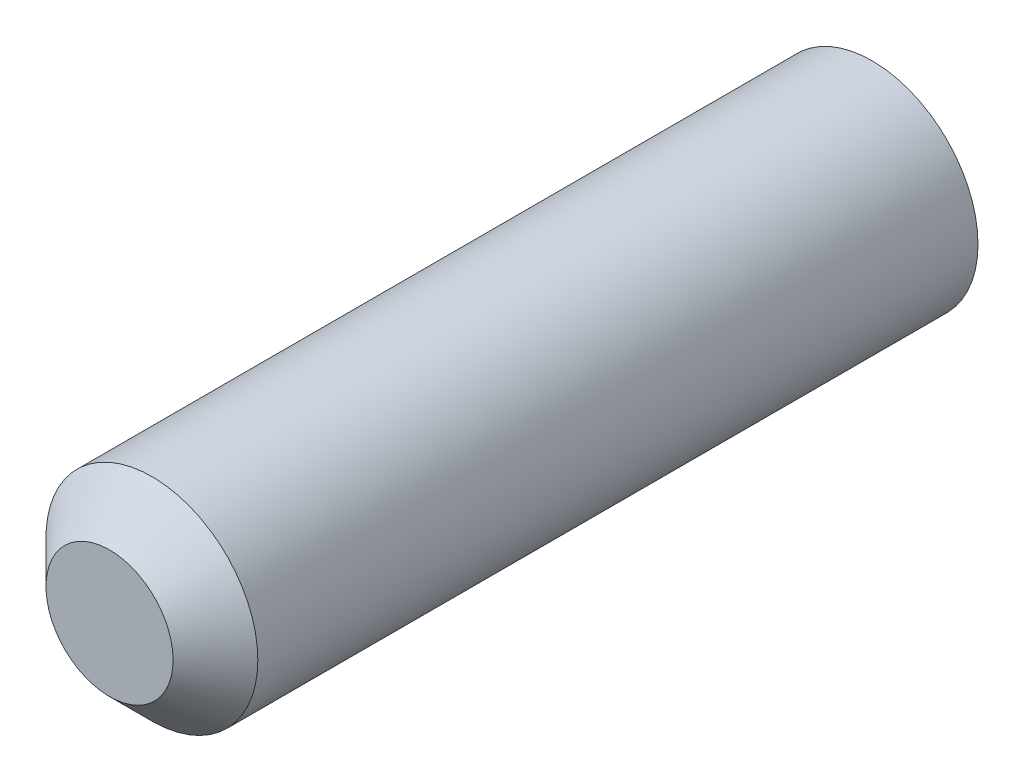
ISO-10303-21;
HEADER;
FILE_DESCRIPTION(('STEP AP214'),'2;1');
FILE_NAME('part.step','',(''),(''),'','','');
FILE_SCHEMA(('AUTOMOTIVE_DESIGN { 1 0 10303 214 1 1 1 1 }'));
ENDSEC;
DATA;
#1=APPLICATION_CONTEXT('core data for automotive mechanical design processes');
#2=APPLICATION_PROTOCOL_DEFINITION('international standard','automotive_design',2000,#1);
#3=PRODUCT_CONTEXT('',#1,'mechanical');
#4=PRODUCT('Part','Part','',(#3));
#5=PRODUCT_RELATED_PRODUCT_CATEGORY('part','',(#4));
#6=PRODUCT_DEFINITION_FORMATION('','',#4);
#7=PRODUCT_DEFINITION_CONTEXT('part definition',#1,'design');
#8=PRODUCT_DEFINITION('design','',#6,#7);
#9=PRODUCT_DEFINITION_SHAPE('','',#8);
#10=(LENGTH_UNIT() NAMED_UNIT(*) SI_UNIT(.MILLI.,.METRE.));
#11=(NAMED_UNIT(*) PLANE_ANGLE_UNIT() SI_UNIT($,.RADIAN.));
#12=(NAMED_UNIT(*) SI_UNIT($,.STERADIAN.) SOLID_ANGLE_UNIT());
#13=UNCERTAINTY_MEASURE_WITH_UNIT(LENGTH_MEASURE(1.E-05),#10,'distance_accuracy_value','');
#14=(GEOMETRIC_REPRESENTATION_CONTEXT(3) GLOBAL_UNCERTAINTY_ASSIGNED_CONTEXT((#13)) GLOBAL_UNIT_ASSIGNED_CONTEXT((#10,
#11,#12)) REPRESENTATION_CONTEXT('',''));
#15=CARTESIAN_POINT('',(0.,0.,0.));
#16=DIRECTION('',(0.,0.,1.));
#17=DIRECTION('',(1.,0.,0.));
#18=AXIS2_PLACEMENT_3D('',#15,#16,#17);
#19=CARTESIAN_POINT('',(0.,0.,22.86));
#20=DIRECTION('',(0.,0.,-1.));
#21=DIRECTION('',(-1.,0.,0.));
#22=AXIS2_PLACEMENT_3D('',#19,#20,#21);
#23=CYLINDRICAL_SURFACE('',#22,6.35);
#24=CARTESIAN_POINT('',(0.,0.,20.32));
#25=DIRECTION('',(0.,0.,1.));
#26=DIRECTION('',(1.,0.,0.));
#27=AXIS2_PLACEMENT_3D('',#24,#25,#26);
#28=CIRCLE('',#27,6.35);
#29=CARTESIAN_POINT('',(6.35,0.,20.32));
#30=VERTEX_POINT('',#29);
#31=EDGE_CURVE('E10',#30,#30,#28,.F.);
#32=ORIENTED_EDGE('',*,*,#31,.T.);
#33=EDGE_LOOP('',(#32));
#34=FACE_BOUND('',#33,.T.);
#35=CARTESIAN_POINT('',(0.,0.,-22.86));
#36=DIRECTION('',(0.,0.,1.));
#37=DIRECTION('',(1.,0.,0.));
#38=AXIS2_PLACEMENT_3D('',#35,#36,#37);
#39=CIRCLE('',#38,6.35);
#40=CARTESIAN_POINT('',(6.35,0.,-22.86));
#41=VERTEX_POINT('',#40);
#42=EDGE_CURVE('E54',#41,#41,#39,.T.);
#43=ORIENTED_EDGE('',*,*,#42,.T.);
#44=EDGE_LOOP('',(#43));
#45=FACE_BOUND('',#44,.T.);
#46=ADVANCED_FACE('F42',(#34,#45),#23,.T.);
#47=CARTESIAN_POINT('',(0.,0.,22.86));
#48=DIRECTION('',(0.,0.,1.));
#49=DIRECTION('',(1.,0.,0.));
#50=AXIS2_PLACEMENT_3D('',#47,#48,#49);
#51=PLANE('',#50);
#52=CARTESIAN_POINT('',(0.,0.,22.86));
#53=DIRECTION('',(0.,0.,1.));
#54=DIRECTION('',(1.,0.,0.));
#55=AXIS2_PLACEMENT_3D('',#52,#53,#54);
#56=CIRCLE('',#55,3.81);
#57=CARTESIAN_POINT('',(3.81,0.,22.86));
#58=VERTEX_POINT('',#57);
#59=EDGE_CURVE('E50',#58,#58,#56,.T.);
#60=ORIENTED_EDGE('',*,*,#59,.T.);
#61=EDGE_LOOP('',(#60));
#62=FACE_BOUND('',#61,.T.);
#63=ADVANCED_FACE('F78',(#62),#51,.T.);
#64=CARTESIAN_POINT('',(0.,0.,-22.86));
#65=DIRECTION('',(0.,0.,1.));
#66=DIRECTION('',(1.,0.,0.));
#67=AXIS2_PLACEMENT_3D('',#64,#65,#66);
#68=PLANE('',#67);
#69=CARTESIAN_POINT('',(0.,0.,-22.86));
#70=DIRECTION('',(0.,0.,-1.));
#71=DIRECTION('',(-1.,0.,0.));
#72=AXIS2_PLACEMENT_3D('',#69,#70,#71);
#73=CIRCLE('',#72,1.9812);
#74=CARTESIAN_POINT('',(-1.9812,0.,-22.86));
#75=VERTEX_POINT('',#74);
#76=EDGE_CURVE('E61',#75,#75,#73,.T.);
#77=ORIENTED_EDGE('',*,*,#76,.F.);
#78=EDGE_LOOP('',(#77));
#79=FACE_BOUND('',#78,.T.);
#80=ORIENTED_EDGE('',*,*,#42,.F.);
#81=EDGE_LOOP('',(#80));
#82=FACE_BOUND('',#81,.T.);
#83=ADVANCED_FACE('F75',(#79,#82),#68,.F.);
#84=CARTESIAN_POINT('',(0.,0.,22.86));
#85=DIRECTION('',(0.,0.,-1.));
#86=DIRECTION('',(-1.,0.,0.));
#87=AXIS2_PLACEMENT_3D('',#84,#85,#86);
#88=CONICAL_SURFACE('',#87,3.81,0.785398163397447);
#89=ORIENTED_EDGE('',*,*,#31,.F.);
#90=EDGE_LOOP('',(#89));
#91=FACE_BOUND('',#90,.T.);
#92=ORIENTED_EDGE('',*,*,#59,.F.);
#93=EDGE_LOOP('',(#92));
#94=FACE_BOUND('',#93,.T.);
#95=ADVANCED_FACE('F45',(#91,#94),#88,.T.);
#96=CARTESIAN_POINT('',(0.,0.,-8.5852));
#97=DIRECTION('',(0.,0.,-1.));
#98=DIRECTION('',(-1.,0.,0.));
#99=AXIS2_PLACEMENT_3D('',#96,#97,#98);
#100=CYLINDRICAL_SURFACE('',#99,1.9812);
#101=CARTESIAN_POINT('',(0.,0.,-8.5852));
#102=DIRECTION('',(0.,0.,-1.));
#103=DIRECTION('',(-1.,0.,0.));
#104=AXIS2_PLACEMENT_3D('',#101,#102,#103);
#105=CIRCLE('',#104,1.9812);
#106=CARTESIAN_POINT('',(-1.9812,0.,-8.5852));
#107=VERTEX_POINT('',#106);
#108=EDGE_CURVE('E58',#107,#107,#105,.T.);
#109=ORIENTED_EDGE('',*,*,#108,.F.);
#110=EDGE_LOOP('',(#109));
#111=FACE_BOUND('',#110,.T.);
#112=ORIENTED_EDGE('',*,*,#76,.T.);
#113=EDGE_LOOP('',(#112));
#114=FACE_BOUND('',#113,.T.);
#115=ADVANCED_FACE('F69',(#111,#114),#100,.F.);
#116=CARTESIAN_POINT('',(0.,0.,-8.5852));
#117=DIRECTION('',(0.,0.,-1.));
#118=DIRECTION('',(-1.,0.,0.));
#119=AXIS2_PLACEMENT_3D('',#116,#117,#118);
#120=PLANE('',#119);
#121=ORIENTED_EDGE('',*,*,#108,.T.);
#122=EDGE_LOOP('',(#121));
#123=FACE_BOUND('',#122,.T.);
#124=ADVANCED_FACE('F67',(#123),#120,.T.);
#125=CLOSED_SHELL('',(#46,#63,#83,#95,#115,#124));
#126=MANIFOLD_SOLID_BREP('B2',#125);
#127=ADVANCED_BREP_SHAPE_REPRESENTATION('',(#18,#126),#14);
#128=SHAPE_DEFINITION_REPRESENTATION(#9,#127);
ENDSEC;
END-ISO-10303-21;
